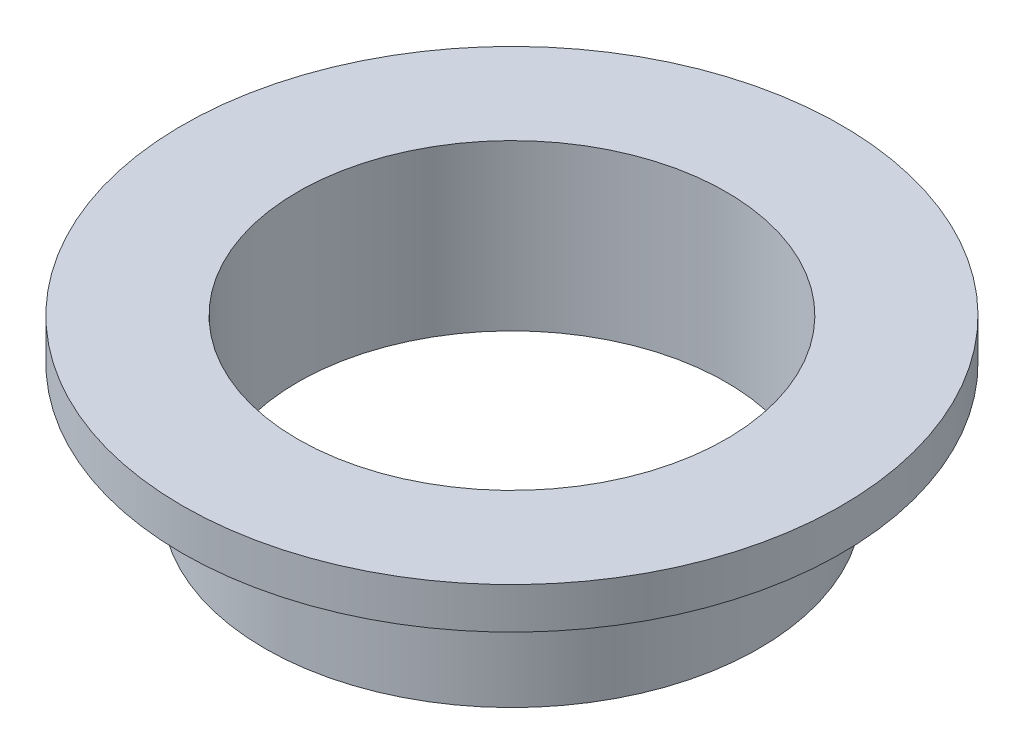
ISO-10303-21;
HEADER;
FILE_DESCRIPTION(('STEP AP214'),'2;1');
FILE_NAME('part.step','',(''),(''),'','','');
FILE_SCHEMA(('AUTOMOTIVE_DESIGN { 1 0 10303 214 1 1 1 1 }'));
ENDSEC;
DATA;
#1=APPLICATION_CONTEXT('core data for automotive mechanical design processes');
#2=APPLICATION_PROTOCOL_DEFINITION('international standard','automotive_design',2000,#1);
#3=PRODUCT_CONTEXT('',#1,'mechanical');
#4=PRODUCT('Part','Part','',(#3));
#5=PRODUCT_RELATED_PRODUCT_CATEGORY('part','',(#4));
#6=PRODUCT_DEFINITION_FORMATION('','',#4);
#7=PRODUCT_DEFINITION_CONTEXT('part definition',#1,'design');
#8=PRODUCT_DEFINITION('design','',#6,#7);
#9=PRODUCT_DEFINITION_SHAPE('','',#8);
#10=(LENGTH_UNIT() NAMED_UNIT(*) SI_UNIT(.MILLI.,.METRE.));
#11=(NAMED_UNIT(*) PLANE_ANGLE_UNIT() SI_UNIT($,.RADIAN.));
#12=(NAMED_UNIT(*) SI_UNIT($,.STERADIAN.) SOLID_ANGLE_UNIT());
#13=UNCERTAINTY_MEASURE_WITH_UNIT(LENGTH_MEASURE(1.E-05),#10,'distance_accuracy_value','');
#14=(GEOMETRIC_REPRESENTATION_CONTEXT(3) GLOBAL_UNCERTAINTY_ASSIGNED_CONTEXT((#13)) GLOBAL_UNIT_ASSIGNED_CONTEXT((#10,
#11,#12)) REPRESENTATION_CONTEXT('',''));
#15=CARTESIAN_POINT('',(0.,0.,0.));
#16=DIRECTION('',(0.,0.,1.));
#17=DIRECTION('',(1.,0.,0.));
#18=AXIS2_PLACEMENT_3D('',#15,#16,#17);
#19=CARTESIAN_POINT('',(0.,0.,0.));
#20=DIRECTION('',(0.,1.,0.));
#21=DIRECTION('',(0.,0.,1.));
#22=AXIS2_PLACEMENT_3D('',#19,#20,#21);
#23=PLANE('',#22);
#24=CARTESIAN_POINT('',(0.,0.,0.));
#25=DIRECTION('',(0.,1.,0.));
#26=DIRECTION('',(0.,0.,1.));
#27=AXIS2_PLACEMENT_3D('',#24,#25,#26);
#28=CIRCLE('',#27,3.);
#29=CARTESIAN_POINT('',(0.,0.,3.));
#30=VERTEX_POINT('',#29);
#31=EDGE_CURVE('E35',#30,#30,#28,.T.);
#32=ORIENTED_EDGE('',*,*,#31,.F.);
#33=EDGE_LOOP('',(#32));
#34=FACE_BOUND('',#33,.T.);
#35=CARTESIAN_POINT('',(0.,0.,0.));
#36=DIRECTION('',(0.,1.,0.));
#37=DIRECTION('',(0.,0.,1.));
#38=AXIS2_PLACEMENT_3D('',#35,#36,#37);
#39=CIRCLE('',#38,2.6);
#40=CARTESIAN_POINT('',(0.,0.,2.6));
#41=VERTEX_POINT('',#40);
#42=EDGE_CURVE('E42',#41,#41,#39,.T.);
#43=ORIENTED_EDGE('',*,*,#42,.T.);
#44=EDGE_LOOP('',(#43));
#45=FACE_BOUND('',#44,.T.);
#46=ADVANCED_FACE('F31',(#34,#45),#23,.F.);
#47=CARTESIAN_POINT('',(0.,1.5,0.));
#48=DIRECTION('',(0.,-1.,0.));
#49=DIRECTION('',(0.,0.,-1.));
#50=AXIS2_PLACEMENT_3D('',#47,#48,#49);
#51=CYLINDRICAL_SURFACE('',#50,3.);
#52=CARTESIAN_POINT('',(0.,1.5,0.));
#53=DIRECTION('',(0.,1.,0.));
#54=DIRECTION('',(0.,0.,1.));
#55=AXIS2_PLACEMENT_3D('',#52,#53,#54);
#56=CIRCLE('',#55,3.);
#57=CARTESIAN_POINT('',(0.,1.5,3.));
#58=VERTEX_POINT('',#57);
#59=EDGE_CURVE('E10',#58,#58,#56,.T.);
#60=ORIENTED_EDGE('',*,*,#59,.F.);
#61=EDGE_LOOP('',(#60));
#62=FACE_BOUND('',#61,.T.);
#63=ORIENTED_EDGE('',*,*,#31,.T.);
#64=EDGE_LOOP('',(#63));
#65=FACE_BOUND('',#64,.T.);
#66=ADVANCED_FACE('F33',(#62,#65),#51,.T.);
#67=CARTESIAN_POINT('',(0.,1.5,0.));
#68=DIRECTION('',(0.,-1.,0.));
#69=DIRECTION('',(0.,0.,-1.));
#70=AXIS2_PLACEMENT_3D('',#67,#68,#69);
#71=CYLINDRICAL_SURFACE('',#70,2.6);
#72=ORIENTED_EDGE('',*,*,#42,.F.);
#73=EDGE_LOOP('',(#72));
#74=FACE_BOUND('',#73,.T.);
#75=CARTESIAN_POINT('',(0.,2.,0.));
#76=DIRECTION('',(0.,1.,0.));
#77=DIRECTION('',(0.,0.,1.));
#78=AXIS2_PLACEMENT_3D('',#75,#76,#77);
#79=CIRCLE('',#78,2.6);
#80=CARTESIAN_POINT('',(0.,2.,2.6));
#81=VERTEX_POINT('',#80);
#82=EDGE_CURVE('E50',#81,#81,#79,.T.);
#83=ORIENTED_EDGE('',*,*,#82,.T.);
#84=EDGE_LOOP('',(#83));
#85=FACE_BOUND('',#84,.T.);
#86=ADVANCED_FACE('F56',(#74,#85),#71,.F.);
#87=CARTESIAN_POINT('',(0.,2.,0.));
#88=DIRECTION('',(0.,1.,0.));
#89=DIRECTION('',(0.,0.,1.));
#90=AXIS2_PLACEMENT_3D('',#87,#88,#89);
#91=PLANE('',#90);
#92=CARTESIAN_POINT('',(0.,2.,0.));
#93=DIRECTION('',(0.,1.,0.));
#94=DIRECTION('',(0.,0.,1.));
#95=AXIS2_PLACEMENT_3D('',#92,#93,#94);
#96=CIRCLE('',#95,4.);
#97=CARTESIAN_POINT('',(0.,2.,4.));
#98=VERTEX_POINT('',#97);
#99=EDGE_CURVE('E46',#98,#98,#96,.T.);
#100=ORIENTED_EDGE('',*,*,#99,.T.);
#101=EDGE_LOOP('',(#100));
#102=FACE_BOUND('',#101,.T.);
#103=ORIENTED_EDGE('',*,*,#82,.F.);
#104=EDGE_LOOP('',(#103));
#105=FACE_BOUND('',#104,.T.);
#106=ADVANCED_FACE('F58',(#102,#105),#91,.T.);
#107=CARTESIAN_POINT('',(0.,1.5,0.));
#108=DIRECTION('',(0.,1.,0.));
#109=DIRECTION('',(0.,0.,1.));
#110=AXIS2_PLACEMENT_3D('',#107,#108,#109);
#111=PLANE('',#110);
#112=ORIENTED_EDGE('',*,*,#59,.T.);
#113=EDGE_LOOP('',(#112));
#114=FACE_BOUND('',#113,.T.);
#115=CARTESIAN_POINT('',(0.,1.5,0.));
#116=DIRECTION('',(0.,1.,0.));
#117=DIRECTION('',(0.,0.,1.));
#118=AXIS2_PLACEMENT_3D('',#115,#116,#117);
#119=CIRCLE('',#118,4.);
#120=CARTESIAN_POINT('',(0.,1.5,4.));
#121=VERTEX_POINT('',#120);
#122=EDGE_CURVE('E47',#121,#121,#119,.T.);
#123=ORIENTED_EDGE('',*,*,#122,.F.);
#124=EDGE_LOOP('',(#123));
#125=FACE_BOUND('',#124,.T.);
#126=ADVANCED_FACE('F60',(#114,#125),#111,.F.);
#127=CARTESIAN_POINT('',(0.,2.,0.));
#128=DIRECTION('',(0.,-1.,0.));
#129=DIRECTION('',(0.,0.,-1.));
#130=AXIS2_PLACEMENT_3D('',#127,#128,#129);
#131=CYLINDRICAL_SURFACE('',#130,4.);
#132=ORIENTED_EDGE('',*,*,#99,.F.);
#133=EDGE_LOOP('',(#132));
#134=FACE_BOUND('',#133,.T.);
#135=ORIENTED_EDGE('',*,*,#122,.T.);
#136=EDGE_LOOP('',(#135));
#137=FACE_BOUND('',#136,.T.);
#138=ADVANCED_FACE('F67',(#134,#137),#131,.T.);
#139=CLOSED_SHELL('',(#46,#66,#86,#106,#126,#138));
#140=MANIFOLD_SOLID_BREP('B2',#139);
#141=ADVANCED_BREP_SHAPE_REPRESENTATION('',(#18,#140),#14);
#142=SHAPE_DEFINITION_REPRESENTATION(#9,#141);
ENDSEC;
END-ISO-10303-21;
